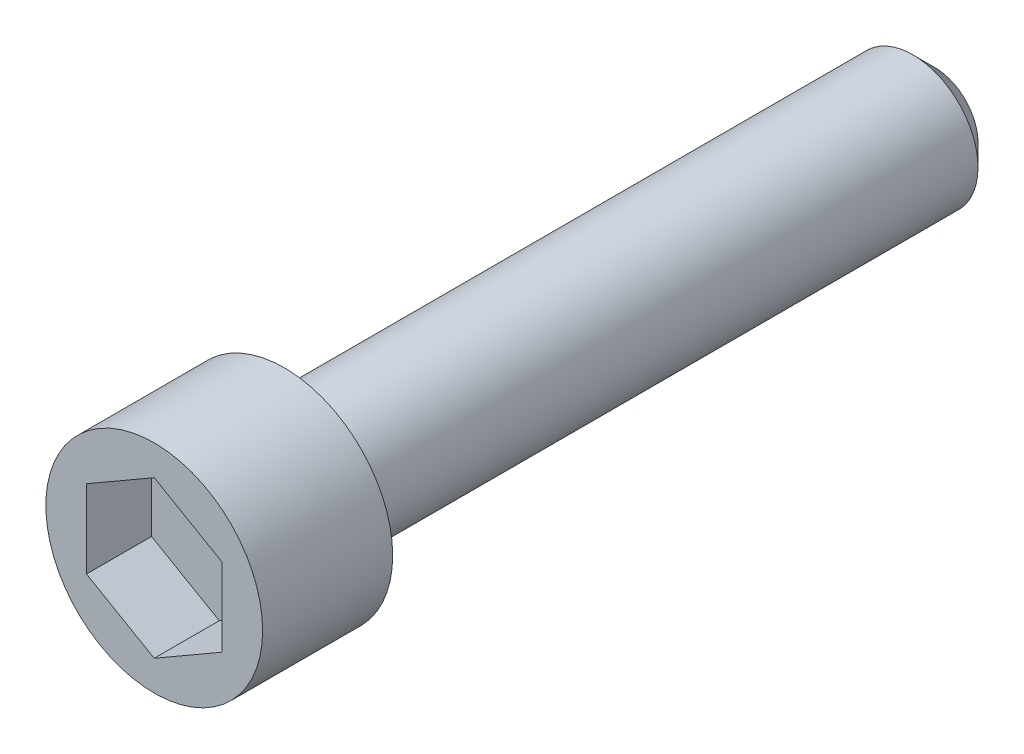
ISO-10303-21;
HEADER;
FILE_DESCRIPTION(('STEP AP214'),'2;1');
FILE_NAME('part.step','',(''),(''),'','','');
FILE_SCHEMA(('AUTOMOTIVE_DESIGN { 1 0 10303 214 1 1 1 1 }'));
ENDSEC;
DATA;
#1=APPLICATION_CONTEXT('core data for automotive mechanical design processes');
#2=APPLICATION_PROTOCOL_DEFINITION('international standard','automotive_design',2000,#1);
#3=PRODUCT_CONTEXT('',#1,'mechanical');
#4=PRODUCT('Part','Part','',(#3));
#5=PRODUCT_RELATED_PRODUCT_CATEGORY('part','',(#4));
#6=PRODUCT_DEFINITION_FORMATION('','',#4);
#7=PRODUCT_DEFINITION_CONTEXT('part definition',#1,'design');
#8=PRODUCT_DEFINITION('design','',#6,#7);
#9=PRODUCT_DEFINITION_SHAPE('','',#8);
#10=(LENGTH_UNIT() NAMED_UNIT(*) SI_UNIT(.MILLI.,.METRE.));
#11=(NAMED_UNIT(*) PLANE_ANGLE_UNIT() SI_UNIT($,.RADIAN.));
#12=(NAMED_UNIT(*) SI_UNIT($,.STERADIAN.) SOLID_ANGLE_UNIT());
#13=UNCERTAINTY_MEASURE_WITH_UNIT(LENGTH_MEASURE(1.E-05),#10,'distance_accuracy_value','');
#14=(GEOMETRIC_REPRESENTATION_CONTEXT(3) GLOBAL_UNCERTAINTY_ASSIGNED_CONTEXT((#13)) GLOBAL_UNIT_ASSIGNED_CONTEXT((#10,
#11,#12)) REPRESENTATION_CONTEXT('',''));
#15=CARTESIAN_POINT('',(0.,0.,0.));
#16=DIRECTION('',(0.,0.,1.));
#17=DIRECTION('',(1.,0.,0.));
#18=AXIS2_PLACEMENT_3D('',#15,#16,#17);
#19=CARTESIAN_POINT('',(0.,0.,15.));
#20=DIRECTION('',(0.,0.,-1.));
#21=DIRECTION('',(-1.,0.,0.));
#22=AXIS2_PLACEMENT_3D('',#19,#20,#21);
#23=CYLINDRICAL_SURFACE('',#22,1.5);
#24=CARTESIAN_POINT('',(0.,0.,0.500000000000006));
#25=DIRECTION('',(0.,0.,1.));
#26=DIRECTION('',(1.,0.,0.));
#27=AXIS2_PLACEMENT_3D('',#24,#25,#26);
#28=CIRCLE('',#27,1.5);
#29=CARTESIAN_POINT('',(1.5,0.,0.500000000000006));
#30=VERTEX_POINT('',#29);
#31=EDGE_CURVE('E47',#30,#30,#28,.T.);
#32=ORIENTED_EDGE('',*,*,#31,.T.);
#33=EDGE_LOOP('',(#32));
#34=FACE_BOUND('',#33,.T.);
#35=CARTESIAN_POINT('',(0.,0.,15.));
#36=DIRECTION('',(0.,0.,1.));
#37=DIRECTION('',(1.,0.,0.));
#38=AXIS2_PLACEMENT_3D('',#35,#36,#37);
#39=CIRCLE('',#38,1.5);
#40=CARTESIAN_POINT('',(1.5,0.,15.));
#41=VERTEX_POINT('',#40);
#42=EDGE_CURVE('E150',#41,#41,#39,.T.);
#43=ORIENTED_EDGE('',*,*,#42,.F.);
#44=EDGE_LOOP('',(#43));
#45=FACE_BOUND('',#44,.T.);
#46=ADVANCED_FACE('F39',(#34,#45),#23,.T.);
#47=CARTESIAN_POINT('',(0.,0.,0.));
#48=DIRECTION('',(0.,0.,1.));
#49=DIRECTION('',(1.,0.,0.));
#50=AXIS2_PLACEMENT_3D('',#47,#48,#49);
#51=PLANE('',#50);
#52=CARTESIAN_POINT('',(0.,0.,0.));
#53=DIRECTION('',(0.,0.,1.));
#54=DIRECTION('',(1.,0.,0.));
#55=AXIS2_PLACEMENT_3D('',#52,#53,#54);
#56=CIRCLE('',#55,0.999999999999992);
#57=CARTESIAN_POINT('',(0.999999999999992,0.,0.));
#58=VERTEX_POINT('',#57);
#59=EDGE_CURVE('E11',#58,#58,#56,.F.);
#60=ORIENTED_EDGE('',*,*,#59,.T.);
#61=EDGE_LOOP('',(#60));
#62=FACE_BOUND('',#61,.T.);
#63=ADVANCED_FACE('F168',(#62),#51,.F.);
#64=CARTESIAN_POINT('',(0.,0.,18.));
#65=DIRECTION('',(0.,0.,-1.));
#66=DIRECTION('',(-1.,0.,0.));
#67=AXIS2_PLACEMENT_3D('',#64,#65,#66);
#68=CYLINDRICAL_SURFACE('',#67,2.5);
#69=CARTESIAN_POINT('',(0.,0.,18.));
#70=DIRECTION('',(0.,0.,1.));
#71=DIRECTION('',(1.,0.,0.));
#72=AXIS2_PLACEMENT_3D('',#69,#70,#71);
#73=CIRCLE('',#72,2.5);
#74=CARTESIAN_POINT('',(2.5,0.,18.));
#75=VERTEX_POINT('',#74);
#76=EDGE_CURVE('E147',#75,#75,#73,.T.);
#77=ORIENTED_EDGE('',*,*,#76,.F.);
#78=EDGE_LOOP('',(#77));
#79=FACE_BOUND('',#78,.T.);
#80=CARTESIAN_POINT('',(0.,0.,15.));
#81=DIRECTION('',(0.,0.,1.));
#82=DIRECTION('',(1.,0.,0.));
#83=AXIS2_PLACEMENT_3D('',#80,#81,#82);
#84=CIRCLE('',#83,2.5);
#85=CARTESIAN_POINT('',(2.5,0.,15.));
#86=VERTEX_POINT('',#85);
#87=EDGE_CURVE('E141',#86,#86,#84,.T.);
#88=ORIENTED_EDGE('',*,*,#87,.T.);
#89=EDGE_LOOP('',(#88));
#90=FACE_BOUND('',#89,.T.);
#91=ADVANCED_FACE('F172',(#79,#90),#68,.T.);
#92=CARTESIAN_POINT('',(0.,0.,18.));
#93=DIRECTION('',(0.,0.,1.));
#94=DIRECTION('',(1.,0.,0.));
#95=AXIS2_PLACEMENT_3D('',#92,#93,#94);
#96=PLANE('',#95);
#97=DIRECTION('',(-0.866025403784442,0.499999999999995,0.));
#98=VECTOR('',#97,1.);
#99=CARTESIAN_POINT('',(1.56177486979958,0.901691141492407,18.));
#100=LINE('',#99,#98);
#101=CARTESIAN_POINT('',(1.56177486979958,0.901691141492407,18.));
#102=VERTEX_POINT('',#101);
#103=CARTESIAN_POINT('',(0.,1.80338228298478,18.));
#104=VERTEX_POINT('',#103);
#105=EDGE_CURVE('E54',#102,#104,#100,.T.);
#106=ORIENTED_EDGE('',*,*,#105,.F.);
#107=DIRECTION('',(0.,1.,0.));
#108=VECTOR('',#107,1.);
#109=CARTESIAN_POINT('',(1.5617748697996,-0.901691141492374,18.));
#110=LINE('',#109,#108);
#111=CARTESIAN_POINT('',(1.5617748697996,-0.901691141492374,18.));
#112=VERTEX_POINT('',#111);
#113=EDGE_CURVE('E137',#112,#102,#110,.T.);
#114=ORIENTED_EDGE('',*,*,#113,.F.);
#115=DIRECTION('',(0.866025403784435,0.500000000000007,0.));
#116=VECTOR('',#115,1.);
#117=CARTESIAN_POINT('',(0.,-1.80338228298478,18.));
#118=LINE('',#117,#116);
#119=CARTESIAN_POINT('',(0.,-1.80338228298478,18.));
#120=VERTEX_POINT('',#119);
#121=EDGE_CURVE('E135',#120,#112,#118,.T.);
#122=ORIENTED_EDGE('',*,*,#121,.F.);
#123=DIRECTION('',(0.866025403784441,-0.499999999999995,0.));
#124=VECTOR('',#123,1.);
#125=CARTESIAN_POINT('',(-1.56177486979959,-0.901691141492395,18.));
#126=LINE('',#125,#124);
#127=CARTESIAN_POINT('',(-1.56177486979959,-0.901691141492395,18.));
#128=VERTEX_POINT('',#127);
#129=EDGE_CURVE('E102',#128,#120,#126,.T.);
#130=ORIENTED_EDGE('',*,*,#129,.F.);
#131=DIRECTION('',(0.,-1.,0.));
#132=VECTOR('',#131,1.);
#133=CARTESIAN_POINT('',(-1.5617748697996,0.901691141492385,18.));
#134=LINE('',#133,#132);
#135=CARTESIAN_POINT('',(-1.5617748697996,0.901691141492385,18.));
#136=VERTEX_POINT('',#135);
#137=EDGE_CURVE('E131',#136,#128,#134,.T.);
#138=ORIENTED_EDGE('',*,*,#137,.F.);
#139=DIRECTION('',(-0.866025403784438,-0.500000000000001,0.));
#140=VECTOR('',#139,1.);
#141=CARTESIAN_POINT('',(0.,1.80338228298478,18.));
#142=LINE('',#141,#140);
#143=EDGE_CURVE('E128',#104,#136,#142,.T.);
#144=ORIENTED_EDGE('',*,*,#143,.F.);
#145=EDGE_LOOP('',(#106,#114,#122,#130,#138,#144));
#146=FACE_BOUND('',#145,.T.);
#147=ORIENTED_EDGE('',*,*,#76,.T.);
#148=EDGE_LOOP('',(#147));
#149=FACE_BOUND('',#148,.T.);
#150=ADVANCED_FACE('F178',(#146,#149),#96,.T.);
#151=CARTESIAN_POINT('',(0.,0.,15.));
#152=DIRECTION('',(0.,0.,1.));
#153=DIRECTION('',(1.,0.,0.));
#154=AXIS2_PLACEMENT_3D('',#151,#152,#153);
#155=PLANE('',#154);
#156=ORIENTED_EDGE('',*,*,#42,.T.);
#157=EDGE_LOOP('',(#156));
#158=FACE_BOUND('',#157,.T.);
#159=ORIENTED_EDGE('',*,*,#87,.F.);
#160=EDGE_LOOP('',(#159));
#161=FACE_BOUND('',#160,.T.);
#162=ADVANCED_FACE('F180',(#158,#161),#155,.F.);
#163=CARTESIAN_POINT('',(1.56177486979958,0.901691141492407,16.5));
#164=DIRECTION('',(0.499999999999995,0.866025403784441,0.));
#165=DIRECTION('',(-0.866025403784442,0.499999999999995,0.));
#166=AXIS2_PLACEMENT_3D('',#163,#164,#165);
#167=PLANE('',#166);
#168=ORIENTED_EDGE('',*,*,#105,.T.);
#169=DIRECTION('',(0.,0.,1.));
#170=VECTOR('',#169,1.);
#171=CARTESIAN_POINT('',(0.,1.80338228298478,16.5));
#172=LINE('',#171,#170);
#173=CARTESIAN_POINT('',(0.,1.80338228298478,16.5));
#174=VERTEX_POINT('',#173);
#175=EDGE_CURVE('E84',#174,#104,#172,.T.);
#176=ORIENTED_EDGE('',*,*,#175,.F.);
#177=DIRECTION('',(-0.866025403784442,0.499999999999995,0.));
#178=VECTOR('',#177,1.);
#179=CARTESIAN_POINT('',(1.56177486979958,0.901691141492407,16.5));
#180=LINE('',#179,#178);
#181=CARTESIAN_POINT('',(1.56177486979958,0.901691141492407,16.5));
#182=VERTEX_POINT('',#181);
#183=EDGE_CURVE('E139',#182,#174,#180,.T.);
#184=ORIENTED_EDGE('',*,*,#183,.F.);
#185=DIRECTION('',(0.,0.,1.));
#186=VECTOR('',#185,1.);
#187=CARTESIAN_POINT('',(1.56177486979958,0.901691141492407,16.5));
#188=LINE('',#187,#186);
#189=EDGE_CURVE('E62',#182,#102,#188,.T.);
#190=ORIENTED_EDGE('',*,*,#189,.T.);
#191=EDGE_LOOP('',(#168,#176,#184,#190));
#192=FACE_BOUND('',#191,.T.);
#193=ADVANCED_FACE('F183',(#192),#167,.F.);
#194=CARTESIAN_POINT('',(1.5617748697996,-0.901691141492374,16.5));
#195=DIRECTION('',(1.,0.,0.));
#196=DIRECTION('',(0.,1.,0.));
#197=AXIS2_PLACEMENT_3D('',#194,#195,#196);
#198=PLANE('',#197);
#199=ORIENTED_EDGE('',*,*,#113,.T.);
#200=ORIENTED_EDGE('',*,*,#189,.F.);
#201=DIRECTION('',(0.,1.,0.));
#202=VECTOR('',#201,1.);
#203=CARTESIAN_POINT('',(1.5617748697996,-0.901691141492374,16.5));
#204=LINE('',#203,#202);
#205=CARTESIAN_POINT('',(1.5617748697996,-0.901691141492374,16.5));
#206=VERTEX_POINT('',#205);
#207=EDGE_CURVE('E114',#206,#182,#204,.T.);
#208=ORIENTED_EDGE('',*,*,#207,.F.);
#209=DIRECTION('',(0.,0.,1.));
#210=VECTOR('',#209,1.);
#211=CARTESIAN_POINT('',(1.5617748697996,-0.901691141492374,16.5));
#212=LINE('',#211,#210);
#213=EDGE_CURVE('E106',#206,#112,#212,.T.);
#214=ORIENTED_EDGE('',*,*,#213,.T.);
#215=EDGE_LOOP('',(#199,#200,#208,#214));
#216=FACE_BOUND('',#215,.T.);
#217=ADVANCED_FACE('F190',(#216),#198,.F.);
#218=CARTESIAN_POINT('',(0.,-1.80338228298478,16.5));
#219=DIRECTION('',(0.500000000000007,-0.866025403784435,0.));
#220=DIRECTION('',(0.866025403784434,0.500000000000007,0.));
#221=AXIS2_PLACEMENT_3D('',#218,#219,#220);
#222=PLANE('',#221);
#223=ORIENTED_EDGE('',*,*,#121,.T.);
#224=ORIENTED_EDGE('',*,*,#213,.F.);
#225=DIRECTION('',(0.866025403784435,0.500000000000007,0.));
#226=VECTOR('',#225,1.);
#227=CARTESIAN_POINT('',(0.,-1.80338228298478,16.5));
#228=LINE('',#227,#226);
#229=CARTESIAN_POINT('',(0.,-1.80338228298478,16.5));
#230=VERTEX_POINT('',#229);
#231=EDGE_CURVE('E110',#230,#206,#228,.T.);
#232=ORIENTED_EDGE('',*,*,#231,.F.);
#233=DIRECTION('',(0.,0.,1.));
#234=VECTOR('',#233,1.);
#235=CARTESIAN_POINT('',(0.,-1.80338228298478,16.5));
#236=LINE('',#235,#234);
#237=EDGE_CURVE('E95',#230,#120,#236,.T.);
#238=ORIENTED_EDGE('',*,*,#237,.T.);
#239=EDGE_LOOP('',(#223,#224,#232,#238));
#240=FACE_BOUND('',#239,.T.);
#241=ADVANCED_FACE('F111',(#240),#222,.F.);
#242=CARTESIAN_POINT('',(-1.56177486979959,-0.901691141492395,16.5));
#243=DIRECTION('',(-0.499999999999995,-0.866025403784441,0.));
#244=DIRECTION('',(0.866025403784442,-0.499999999999995,0.));
#245=AXIS2_PLACEMENT_3D('',#242,#243,#244);
#246=PLANE('',#245);
#247=ORIENTED_EDGE('',*,*,#129,.T.);
#248=ORIENTED_EDGE('',*,*,#237,.F.);
#249=DIRECTION('',(0.866025403784441,-0.499999999999995,0.));
#250=VECTOR('',#249,1.);
#251=CARTESIAN_POINT('',(-1.56177486979959,-0.901691141492395,16.5));
#252=LINE('',#251,#250);
#253=CARTESIAN_POINT('',(-1.56177486979959,-0.901691141492395,16.5));
#254=VERTEX_POINT('',#253);
#255=EDGE_CURVE('E99',#254,#230,#252,.T.);
#256=ORIENTED_EDGE('',*,*,#255,.F.);
#257=DIRECTION('',(0.,0.,1.));
#258=VECTOR('',#257,1.);
#259=CARTESIAN_POINT('',(-1.56177486979959,-0.901691141492395,16.5));
#260=LINE('',#259,#258);
#261=EDGE_CURVE('E107',#254,#128,#260,.T.);
#262=ORIENTED_EDGE('',*,*,#261,.T.);
#263=EDGE_LOOP('',(#247,#248,#256,#262));
#264=FACE_BOUND('',#263,.T.);
#265=ADVANCED_FACE('F97',(#264),#246,.F.);
#266=CARTESIAN_POINT('',(-1.5617748697996,0.901691141492385,16.5));
#267=DIRECTION('',(-1.,0.,0.));
#268=DIRECTION('',(0.,-1.,0.));
#269=AXIS2_PLACEMENT_3D('',#266,#267,#268);
#270=PLANE('',#269);
#271=ORIENTED_EDGE('',*,*,#137,.T.);
#272=ORIENTED_EDGE('',*,*,#261,.F.);
#273=DIRECTION('',(0.,-1.,0.));
#274=VECTOR('',#273,1.);
#275=CARTESIAN_POINT('',(-1.5617748697996,0.901691141492385,16.5));
#276=LINE('',#275,#274);
#277=CARTESIAN_POINT('',(-1.5617748697996,0.901691141492385,16.5));
#278=VERTEX_POINT('',#277);
#279=EDGE_CURVE('E120',#278,#254,#276,.T.);
#280=ORIENTED_EDGE('',*,*,#279,.F.);
#281=DIRECTION('',(0.,0.,1.));
#282=VECTOR('',#281,1.);
#283=CARTESIAN_POINT('',(-1.5617748697996,0.901691141492385,16.5));
#284=LINE('',#283,#282);
#285=EDGE_CURVE('E144',#278,#136,#284,.T.);
#286=ORIENTED_EDGE('',*,*,#285,.T.);
#287=EDGE_LOOP('',(#271,#272,#280,#286));
#288=FACE_BOUND('',#287,.T.);
#289=ADVANCED_FACE('F193',(#288),#270,.F.);
#290=CARTESIAN_POINT('',(0.,1.80338228298478,16.5));
#291=DIRECTION('',(-0.500000000000001,0.866025403784438,0.));
#292=DIRECTION('',(-0.866025403784438,-0.500000000000001,0.));
#293=AXIS2_PLACEMENT_3D('',#290,#291,#292);
#294=PLANE('',#293);
#295=ORIENTED_EDGE('',*,*,#143,.T.);
#296=ORIENTED_EDGE('',*,*,#285,.F.);
#297=DIRECTION('',(-0.866025403784438,-0.500000000000001,0.));
#298=VECTOR('',#297,1.);
#299=CARTESIAN_POINT('',(0.,1.80338228298478,16.5));
#300=LINE('',#299,#298);
#301=EDGE_CURVE('E122',#174,#278,#300,.T.);
#302=ORIENTED_EDGE('',*,*,#301,.F.);
#303=ORIENTED_EDGE('',*,*,#175,.T.);
#304=EDGE_LOOP('',(#295,#296,#302,#303));
#305=FACE_BOUND('',#304,.T.);
#306=ADVANCED_FACE('F164',(#305),#294,.F.);
#307=CARTESIAN_POINT('',(0.,0.,16.5));
#308=DIRECTION('',(0.,0.,1.));
#309=DIRECTION('',(1.,0.,0.));
#310=AXIS2_PLACEMENT_3D('',#307,#308,#309);
#311=PLANE('',#310);
#312=ORIENTED_EDGE('',*,*,#183,.T.);
#313=ORIENTED_EDGE('',*,*,#301,.T.);
#314=ORIENTED_EDGE('',*,*,#279,.T.);
#315=ORIENTED_EDGE('',*,*,#255,.T.);
#316=ORIENTED_EDGE('',*,*,#231,.T.);
#317=ORIENTED_EDGE('',*,*,#207,.T.);
#318=EDGE_LOOP('',(#312,#313,#314,#315,#316,#317));
#319=FACE_BOUND('',#318,.T.);
#320=ADVANCED_FACE('F117',(#319),#311,.T.);
#321=CARTESIAN_POINT('',(0.,0.,0.500000000000006));
#322=DIRECTION('',(0.,0.,1.));
#323=DIRECTION('',(1.,0.,0.));
#324=AXIS2_PLACEMENT_3D('',#321,#322,#323);
#325=CONICAL_SURFACE('',#324,1.5,0.785398163397452);
#326=ORIENTED_EDGE('',*,*,#59,.F.);
#327=EDGE_LOOP('',(#326));
#328=FACE_BOUND('',#327,.T.);
#329=ORIENTED_EDGE('',*,*,#31,.F.);
#330=EDGE_LOOP('',(#329));
#331=FACE_BOUND('',#330,.T.);
#332=ADVANCED_FACE('F41',(#328,#331),#325,.T.);
#333=CLOSED_SHELL('',(#46,#63,#91,#150,#162,#193,#217,#241,#265,#289,#306,#320,#332));
#334=MANIFOLD_SOLID_BREP('B2',#333);
#335=ADVANCED_BREP_SHAPE_REPRESENTATION('',(#18,#334),#14);
#336=SHAPE_DEFINITION_REPRESENTATION(#9,#335);
ENDSEC;
END-ISO-10303-21;
